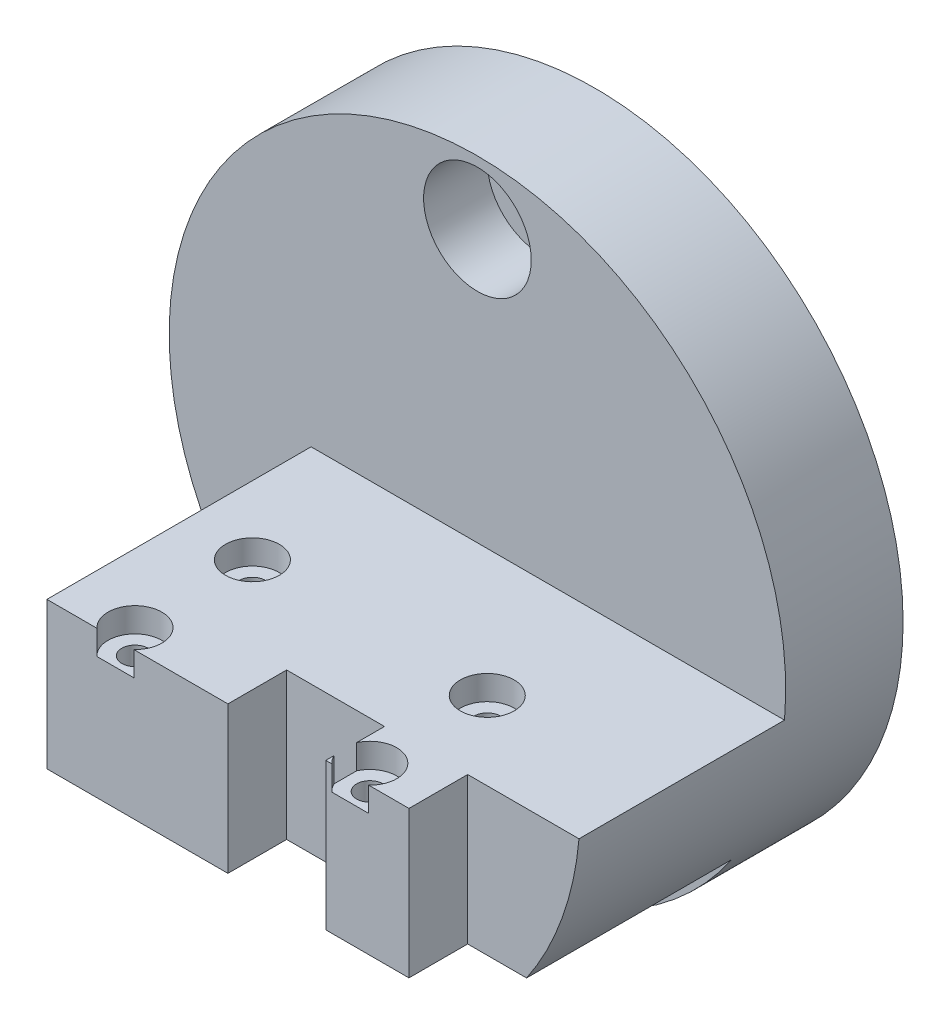
ISO-10303-21;
HEADER;
FILE_DESCRIPTION(('STEP AP214'),'2;1');
FILE_NAME('part.step','',(''),(''),'','','');
FILE_SCHEMA(('AUTOMOTIVE_DESIGN { 1 0 10303 214 1 1 1 1 }'));
ENDSEC;
DATA;
#1=APPLICATION_CONTEXT('core data for automotive mechanical design processes');
#2=APPLICATION_PROTOCOL_DEFINITION('international standard','automotive_design',2000,#1);
#3=PRODUCT_CONTEXT('',#1,'mechanical');
#4=PRODUCT('Part','Part','',(#3));
#5=PRODUCT_RELATED_PRODUCT_CATEGORY('part','',(#4));
#6=PRODUCT_DEFINITION_FORMATION('','',#4);
#7=PRODUCT_DEFINITION_CONTEXT('part definition',#1,'design');
#8=PRODUCT_DEFINITION('design','',#6,#7);
#9=PRODUCT_DEFINITION_SHAPE('','',#8);
#10=(LENGTH_UNIT() NAMED_UNIT(*) SI_UNIT(.MILLI.,.METRE.));
#11=(NAMED_UNIT(*) PLANE_ANGLE_UNIT() SI_UNIT($,.RADIAN.));
#12=(NAMED_UNIT(*) SI_UNIT($,.STERADIAN.) SOLID_ANGLE_UNIT());
#13=UNCERTAINTY_MEASURE_WITH_UNIT(LENGTH_MEASURE(1.E-05),#10,'distance_accuracy_value','');
#14=(GEOMETRIC_REPRESENTATION_CONTEXT(3) GLOBAL_UNCERTAINTY_ASSIGNED_CONTEXT((#13)) GLOBAL_UNIT_ASSIGNED_CONTEXT((#10,
#11,#12)) REPRESENTATION_CONTEXT('',''));
#15=CARTESIAN_POINT('',(0.,0.,0.));
#16=DIRECTION('',(0.,0.,1.));
#17=DIRECTION('',(1.,0.,0.));
#18=AXIS2_PLACEMENT_3D('',#15,#16,#17);
#19=CARTESIAN_POINT('',(31.3797307190486,-2.75,39.));
#20=DIRECTION('',(0.,1.,0.));
#21=DIRECTION('',(0.,0.,1.));
#22=AXIS2_PLACEMENT_3D('',#19,#20,#21);
#23=PLANE('',#22);
#24=DIRECTION('',(0.,0.,-1.));
#25=VECTOR('',#24,1.);
#26=CARTESIAN_POINT('',(11.5047931890486,-2.75,39.));
#27=LINE('',#26,#25);
#28=CARTESIAN_POINT('',(11.5047931890486,-2.75,39.));
#29=VERTEX_POINT('',#28);
#30=CARTESIAN_POINT('',(11.5047931890486,-2.75,38.145643923739));
#31=VERTEX_POINT('',#30);
#32=EDGE_CURVE('E259',#29,#31,#27,.T.);
#33=ORIENTED_EDGE('',*,*,#32,.F.);
#34=DIRECTION('',(1.,0.,0.));
#35=VECTOR('',#34,1.);
#36=CARTESIAN_POINT('',(31.3797307190486,-2.75,39.));
#37=LINE('',#36,#35);
#38=CARTESIAN_POINT('',(12.1173345802309,-2.75,39.));
#39=VERTEX_POINT('',#38);
#40=EDGE_CURVE('E261',#29,#39,#37,.T.);
#41=ORIENTED_EDGE('',*,*,#40,.T.);
#42=CARTESIAN_POINT('',(14.0047931890486,-2.75,37.));
#43=DIRECTION('',(0.,1.,0.));
#44=DIRECTION('',(0.,0.,1.));
#45=AXIS2_PLACEMENT_3D('',#42,#43,#44);
#46=CIRCLE('',#45,2.75);
#47=EDGE_CURVE('E245',#31,#39,#46,.T.);
#48=ORIENTED_EDGE('',*,*,#47,.F.);
#49=EDGE_LOOP('',(#33,#41,#48));
#50=FACE_BOUND('',#49,.T.);
#51=ADVANCED_FACE('F33',(#50),#23,.T.);
#52=CARTESIAN_POINT('',(0.,0.,39.));
#53=DIRECTION('',(0.,0.,1.));
#54=DIRECTION('',(1.,0.,0.));
#55=AXIS2_PLACEMENT_3D('',#52,#53,#54);
#56=PLANE('',#55);
#57=DIRECTION('',(0.,1.,0.));
#58=VECTOR('',#57,1.);
#59=CARTESIAN_POINT('',(-16.9952068109514,-17.75,39.));
#60=LINE('',#59,#58);
#61=CARTESIAN_POINT('',(-16.9952068109514,-17.75,39.));
#62=VERTEX_POINT('',#61);
#63=CARTESIAN_POINT('',(-16.9952068109514,-2.75,39.));
#64=VERTEX_POINT('',#63);
#65=EDGE_CURVE('E153',#62,#64,#60,.T.);
#66=ORIENTED_EDGE('',*,*,#65,.F.);
#67=DIRECTION('',(-1.,0.,0.));
#68=VECTOR('',#67,1.);
#69=CARTESIAN_POINT('',(26.0228265182705,-17.75,39.));
#70=LINE('',#69,#68);
#71=CARTESIAN_POINT('',(1.50479318904857,-17.75,39.));
#72=VERTEX_POINT('',#71);
#73=EDGE_CURVE('E165',#72,#62,#70,.T.);
#74=ORIENTED_EDGE('',*,*,#73,.F.);
#75=DIRECTION('',(0.,1.,0.));
#76=VECTOR('',#75,1.);
#77=CARTESIAN_POINT('',(1.50479318904857,-17.75,39.));
#78=LINE('',#77,#76);
#79=CARTESIAN_POINT('',(1.50479318904857,-2.75,39.));
#80=VERTEX_POINT('',#79);
#81=EDGE_CURVE('E663',#72,#80,#78,.T.);
#82=ORIENTED_EDGE('',*,*,#81,.T.);
#83=CARTESIAN_POINT('',(-8.10774820213375,-2.75,39.));
#84=VERTEX_POINT('',#83);
#85=EDGE_CURVE('E293',#84,#80,#37,.T.);
#86=ORIENTED_EDGE('',*,*,#85,.F.);
#87=DIRECTION('',(0.,1.,0.));
#88=VECTOR('',#87,1.);
#89=CARTESIAN_POINT('',(-8.10774820213375,-2.75,39.));
#90=LINE('',#89,#88);
#91=CARTESIAN_POINT('',(-8.10774820213375,-5.25,39.));
#92=VERTEX_POINT('',#91);
#93=EDGE_CURVE('E224',#92,#84,#90,.T.);
#94=ORIENTED_EDGE('',*,*,#93,.F.);
#95=DIRECTION('',(1.,0.,0.));
#96=VECTOR('',#95,1.);
#97=CARTESIAN_POINT('',(0.,-5.25,39.));
#98=LINE('',#97,#96);
#99=CARTESIAN_POINT('',(-11.8826654197691,-5.25,39.));
#100=VERTEX_POINT('',#99);
#101=EDGE_CURVE('E222',#100,#92,#98,.T.);
#102=ORIENTED_EDGE('',*,*,#101,.F.);
#103=DIRECTION('',(0.,1.,0.));
#104=VECTOR('',#103,1.);
#105=CARTESIAN_POINT('',(-11.8826654197691,-2.75,39.));
#106=LINE('',#105,#104);
#107=CARTESIAN_POINT('',(-11.8826654197691,-2.75,39.));
#108=VERTEX_POINT('',#107);
#109=EDGE_CURVE('E218',#108,#100,#106,.F.);
#110=ORIENTED_EDGE('',*,*,#109,.F.);
#111=EDGE_CURVE('E178',#64,#108,#37,.T.);
#112=ORIENTED_EDGE('',*,*,#111,.F.);
#113=EDGE_LOOP('',(#66,#74,#82,#86,#94,#102,#110,#112));
#114=FACE_BOUND('',#113,.T.);
#115=ADVANCED_FACE('F311',(#114),#56,.T.);
#116=CARTESIAN_POINT('',(14.0047931890486,-2.75,37.));
#117=DIRECTION('',(0.,1.,0.));
#118=DIRECTION('',(0.,0.,1.));
#119=AXIS2_PLACEMENT_3D('',#116,#117,#118);
#120=CYLINDRICAL_SURFACE('',#119,2.75);
#121=CARTESIAN_POINT('',(15.8922517978663,-2.75,39.));
#122=VERTEX_POINT('',#121);
#123=CARTESIAN_POINT('',(11.5047931890486,-2.75,35.854356076261));
#124=VERTEX_POINT('',#123);
#125=EDGE_CURVE('E262',#122,#124,#46,.T.);
#126=ORIENTED_EDGE('',*,*,#125,.T.);
#127=DIRECTION('',(0.,1.,0.));
#128=VECTOR('',#127,1.);
#129=CARTESIAN_POINT('',(11.5047931890486,-2.75,35.854356076261));
#130=LINE('',#129,#128);
#131=CARTESIAN_POINT('',(11.5047931890486,-5.25,35.854356076261));
#132=VERTEX_POINT('',#131);
#133=EDGE_CURVE('E11',#124,#132,#130,.F.);
#134=ORIENTED_EDGE('',*,*,#133,.T.);
#135=CARTESIAN_POINT('',(14.0047931890486,-5.25,37.));
#136=DIRECTION('',(0.,1.,0.));
#137=DIRECTION('',(0.,0.,1.));
#138=AXIS2_PLACEMENT_3D('',#135,#136,#137);
#139=CIRCLE('',#138,2.75);
#140=CARTESIAN_POINT('',(15.8922517978663,-5.25,39.));
#141=VERTEX_POINT('',#140);
#142=EDGE_CURVE('E268',#141,#132,#139,.T.);
#143=ORIENTED_EDGE('',*,*,#142,.F.);
#144=DIRECTION('',(0.,1.,0.));
#145=VECTOR('',#144,1.);
#146=CARTESIAN_POINT('',(15.8922517978663,-2.75,39.));
#147=LINE('',#146,#145);
#148=EDGE_CURVE('E236',#141,#122,#147,.T.);
#149=ORIENTED_EDGE('',*,*,#148,.T.);
#150=EDGE_LOOP('',(#126,#134,#143,#149));
#151=FACE_BOUND('',#150,.T.);
#152=ADVANCED_FACE('F335',(#151),#120,.F.);
#153=CARTESIAN_POINT('',(0.,0.,12.));
#154=DIRECTION('',(0.,0.,1.));
#155=DIRECTION('',(1.,0.,0.));
#156=AXIS2_PLACEMENT_3D('',#153,#154,#155);
#157=PLANE('',#156);
#158=CARTESIAN_POINT('',(0.,25.,12.));
#159=DIRECTION('',(0.,0.,1.));
#160=DIRECTION('',(1.,0.,0.));
#161=AXIS2_PLACEMENT_3D('',#158,#159,#160);
#162=CIRCLE('',#161,5.5);
#163=CARTESIAN_POINT('',(5.5,25.,12.));
#164=VERTEX_POINT('',#163);
#165=EDGE_CURVE('E190',#164,#164,#162,.T.);
#166=ORIENTED_EDGE('',*,*,#165,.F.);
#167=EDGE_LOOP('',(#166));
#168=FACE_BOUND('',#167,.T.);
#169=DIRECTION('',(1.,0.,0.));
#170=VECTOR('',#169,1.);
#171=CARTESIAN_POINT('',(31.3797307190486,-2.75,12.));
#172=LINE('',#171,#170);
#173=CARTESIAN_POINT('',(-16.9952068109514,-2.75,12.));
#174=VERTEX_POINT('',#173);
#175=CARTESIAN_POINT('',(31.3797307190486,-2.75,12.));
#176=VERTEX_POINT('',#175);
#177=EDGE_CURVE('E170',#174,#176,#172,.T.);
#178=ORIENTED_EDGE('',*,*,#177,.T.);
#179=CARTESIAN_POINT('',(0.,0.,12.));
#180=DIRECTION('',(0.,0.,1.));
#181=DIRECTION('',(1.,0.,0.));
#182=AXIS2_PLACEMENT_3D('',#179,#180,#181);
#183=CIRCLE('',#182,31.5);
#184=CARTESIAN_POINT('',(26.0228265182705,-17.75,12.));
#185=VERTEX_POINT('',#184);
#186=EDGE_CURVE('E169',#176,#185,#183,.T.);
#187=ORIENTED_EDGE('',*,*,#186,.T.);
#188=DIRECTION('',(-1.,0.,0.));
#189=VECTOR('',#188,1.);
#190=CARTESIAN_POINT('',(26.0228265182705,-17.75,12.));
#191=LINE('',#190,#189);
#192=CARTESIAN_POINT('',(-16.9952068109514,-17.75,12.));
#193=VERTEX_POINT('',#192);
#194=EDGE_CURVE('E161',#185,#193,#191,.T.);
#195=ORIENTED_EDGE('',*,*,#194,.T.);
#196=DIRECTION('',(0.,1.,0.));
#197=VECTOR('',#196,1.);
#198=CARTESIAN_POINT('',(-16.9952068109514,-17.75,12.));
#199=LINE('',#198,#197);
#200=EDGE_CURVE('E144',#193,#174,#199,.T.);
#201=ORIENTED_EDGE('',*,*,#200,.T.);
#202=EDGE_LOOP('',(#178,#187,#195,#201));
#203=FACE_BOUND('',#202,.T.);
#204=CARTESIAN_POINT('',(0.,-25.,12.));
#205=DIRECTION('',(0.,0.,1.));
#206=DIRECTION('',(1.,0.,0.));
#207=AXIS2_PLACEMENT_3D('',#204,#205,#206);
#208=CIRCLE('',#207,5.5);
#209=CARTESIAN_POINT('',(5.5,-25.,12.));
#210=VERTEX_POINT('',#209);
#211=EDGE_CURVE('E204',#210,#210,#208,.T.);
#212=ORIENTED_EDGE('',*,*,#211,.F.);
#213=EDGE_LOOP('',(#212));
#214=FACE_BOUND('',#213,.T.);
#215=ADVANCED_FACE('F167',(#168,#203,#214),#157,.T.);
#216=CARTESIAN_POINT('',(0.,0.,12.));
#217=DIRECTION('',(0.,0.,-1.));
#218=DIRECTION('',(-1.,0.,0.));
#219=AXIS2_PLACEMENT_3D('',#216,#217,#218);
#220=CYLINDRICAL_SURFACE('',#219,31.5);
#221=ORIENTED_EDGE('',*,*,#186,.F.);
#222=DIRECTION('',(0.,0.,-1.));
#223=VECTOR('',#222,1.);
#224=CARTESIAN_POINT('',(31.3797307190486,-2.75,39.));
#225=LINE('',#224,#223);
#226=CARTESIAN_POINT('',(31.3797307190486,-2.75,33.));
#227=VERTEX_POINT('',#226);
#228=EDGE_CURVE('E181',#227,#176,#225,.T.);
#229=ORIENTED_EDGE('',*,*,#228,.F.);
#230=CARTESIAN_POINT('',(0.,0.,33.));
#231=DIRECTION('',(0.,0.,-1.));
#232=DIRECTION('',(-1.,0.,0.));
#233=AXIS2_PLACEMENT_3D('',#230,#231,#232);
#234=CIRCLE('',#233,31.5);
#235=CARTESIAN_POINT('',(26.0228265182705,-17.75,33.));
#236=VERTEX_POINT('',#235);
#237=EDGE_CURVE('E429',#227,#236,#234,.T.);
#238=ORIENTED_EDGE('',*,*,#237,.T.);
#239=DIRECTION('',(0.,0.,-1.));
#240=VECTOR('',#239,1.);
#241=CARTESIAN_POINT('',(26.0228265182705,-17.75,39.));
#242=LINE('',#241,#240);
#243=EDGE_CURVE('E185',#236,#185,#242,.T.);
#244=ORIENTED_EDGE('',*,*,#243,.T.);
#245=EDGE_LOOP('',(#221,#229,#238,#244));
#246=FACE_BOUND('',#245,.T.);
#247=CARTESIAN_POINT('',(0.,0.,0.));
#248=DIRECTION('',(0.,0.,1.));
#249=DIRECTION('',(1.,0.,0.));
#250=AXIS2_PLACEMENT_3D('',#247,#248,#249);
#251=CIRCLE('',#250,31.5);
#252=CARTESIAN_POINT('',(31.5,0.,0.));
#253=VERTEX_POINT('',#252);
#254=EDGE_CURVE('E216',#253,#253,#251,.T.);
#255=ORIENTED_EDGE('',*,*,#254,.T.);
#256=EDGE_LOOP('',(#255));
#257=FACE_BOUND('',#256,.T.);
#258=ADVANCED_FACE('F35',(#246,#257),#220,.T.);
#259=CARTESIAN_POINT('',(0.,0.,0.));
#260=DIRECTION('',(0.,0.,1.));
#261=DIRECTION('',(1.,0.,0.));
#262=AXIS2_PLACEMENT_3D('',#259,#260,#261);
#263=PLANE('',#262);
#264=CARTESIAN_POINT('',(-17.6776695296637,17.6776695296637,0.));
#265=DIRECTION('',(0.,0.,-1.));
#266=DIRECTION('',(-1.,0.,0.));
#267=AXIS2_PLACEMENT_3D('',#264,#265,#266);
#268=CIRCLE('',#267,3.15);
#269=CARTESIAN_POINT('',(-20.8276695296637,17.6776695296637,0.));
#270=VERTEX_POINT('',#269);
#271=EDGE_CURVE('E184',#270,#270,#268,.T.);
#272=ORIENTED_EDGE('',*,*,#271,.F.);
#273=EDGE_LOOP('',(#272));
#274=FACE_BOUND('',#273,.T.);
#275=CARTESIAN_POINT('',(0.,25.,0.));
#276=DIRECTION('',(0.,0.,1.));
#277=DIRECTION('',(1.,0.,0.));
#278=AXIS2_PLACEMENT_3D('',#275,#276,#277);
#279=CIRCLE('',#278,3.3);
#280=CARTESIAN_POINT('',(3.3,25.,0.));
#281=VERTEX_POINT('',#280);
#282=EDGE_CURVE('E201',#281,#281,#279,.T.);
#283=ORIENTED_EDGE('',*,*,#282,.T.);
#284=EDGE_LOOP('',(#283));
#285=FACE_BOUND('',#284,.T.);
#286=CARTESIAN_POINT('',(0.,-25.,0.));
#287=DIRECTION('',(0.,0.,1.));
#288=DIRECTION('',(1.,0.,0.));
#289=AXIS2_PLACEMENT_3D('',#286,#287,#288);
#290=CIRCLE('',#289,3.3);
#291=CARTESIAN_POINT('',(3.3,-25.,0.));
#292=VERTEX_POINT('',#291);
#293=EDGE_CURVE('E213',#292,#292,#290,.T.);
#294=ORIENTED_EDGE('',*,*,#293,.T.);
#295=EDGE_LOOP('',(#294));
#296=FACE_BOUND('',#295,.T.);
#297=ORIENTED_EDGE('',*,*,#254,.F.);
#298=EDGE_LOOP('',(#297));
#299=FACE_BOUND('',#298,.T.);
#300=ADVANCED_FACE('F377',(#274,#285,#296,#299),#263,.F.);
#301=CARTESIAN_POINT('',(0.,-25.,12.));
#302=DIRECTION('',(0.,0.,1.));
#303=DIRECTION('',(1.,0.,0.));
#304=AXIS2_PLACEMENT_3D('',#301,#302,#303);
#305=CYLINDRICAL_SURFACE('',#304,3.3);
#306=ORIENTED_EDGE('',*,*,#293,.F.);
#307=EDGE_LOOP('',(#306));
#308=FACE_BOUND('',#307,.T.);
#309=CARTESIAN_POINT('',(0.,-25.,5.5));
#310=DIRECTION('',(0.,0.,1.));
#311=DIRECTION('',(1.,0.,0.));
#312=AXIS2_PLACEMENT_3D('',#309,#310,#311);
#313=CIRCLE('',#312,3.3);
#314=CARTESIAN_POINT('',(3.3,-25.,5.5));
#315=VERTEX_POINT('',#314);
#316=EDGE_CURVE('E210',#315,#315,#313,.T.);
#317=ORIENTED_EDGE('',*,*,#316,.T.);
#318=EDGE_LOOP('',(#317));
#319=FACE_BOUND('',#318,.T.);
#320=ADVANCED_FACE('F373',(#308,#319),#305,.F.);
#321=CARTESIAN_POINT('',(3.3,-25.,5.5));
#322=DIRECTION('',(0.,0.,-1.));
#323=DIRECTION('',(-1.,0.,0.));
#324=AXIS2_PLACEMENT_3D('',#321,#322,#323);
#325=PLANE('',#324);
#326=ORIENTED_EDGE('',*,*,#316,.F.);
#327=EDGE_LOOP('',(#326));
#328=FACE_BOUND('',#327,.T.);
#329=CARTESIAN_POINT('',(0.,-25.,5.5));
#330=DIRECTION('',(0.,0.,1.));
#331=DIRECTION('',(1.,0.,0.));
#332=AXIS2_PLACEMENT_3D('',#329,#330,#331);
#333=CIRCLE('',#332,5.5);
#334=CARTESIAN_POINT('',(5.5,-25.,5.5));
#335=VERTEX_POINT('',#334);
#336=EDGE_CURVE('E207',#335,#335,#333,.T.);
#337=ORIENTED_EDGE('',*,*,#336,.T.);
#338=EDGE_LOOP('',(#337));
#339=FACE_BOUND('',#338,.T.);
#340=ADVANCED_FACE('F369',(#328,#339),#325,.F.);
#341=CARTESIAN_POINT('',(0.,-25.,12.));
#342=DIRECTION('',(0.,0.,1.));
#343=DIRECTION('',(1.,0.,0.));
#344=AXIS2_PLACEMENT_3D('',#341,#342,#343);
#345=CYLINDRICAL_SURFACE('',#344,5.5);
#346=ORIENTED_EDGE('',*,*,#336,.F.);
#347=EDGE_LOOP('',(#346));
#348=FACE_BOUND('',#347,.T.);
#349=ORIENTED_EDGE('',*,*,#211,.T.);
#350=EDGE_LOOP('',(#349));
#351=FACE_BOUND('',#350,.T.);
#352=ADVANCED_FACE('F365',(#348,#351),#345,.F.);
#353=CARTESIAN_POINT('',(0.,25.,12.));
#354=DIRECTION('',(0.,0.,1.));
#355=DIRECTION('',(1.,0.,0.));
#356=AXIS2_PLACEMENT_3D('',#353,#354,#355);
#357=CYLINDRICAL_SURFACE('',#356,3.3);
#358=ORIENTED_EDGE('',*,*,#282,.F.);
#359=EDGE_LOOP('',(#358));
#360=FACE_BOUND('',#359,.T.);
#361=CARTESIAN_POINT('',(0.,25.,5.5));
#362=DIRECTION('',(0.,0.,1.));
#363=DIRECTION('',(1.,0.,0.));
#364=AXIS2_PLACEMENT_3D('',#361,#362,#363);
#365=CIRCLE('',#364,3.3);
#366=CARTESIAN_POINT('',(3.3,25.,5.5));
#367=VERTEX_POINT('',#366);
#368=EDGE_CURVE('E198',#367,#367,#365,.T.);
#369=ORIENTED_EDGE('',*,*,#368,.T.);
#370=EDGE_LOOP('',(#369));
#371=FACE_BOUND('',#370,.T.);
#372=ADVANCED_FACE('F361',(#360,#371),#357,.F.);
#373=CARTESIAN_POINT('',(3.3,25.,5.5));
#374=DIRECTION('',(0.,0.,-1.));
#375=DIRECTION('',(-1.,0.,0.));
#376=AXIS2_PLACEMENT_3D('',#373,#374,#375);
#377=PLANE('',#376);
#378=ORIENTED_EDGE('',*,*,#368,.F.);
#379=EDGE_LOOP('',(#378));
#380=FACE_BOUND('',#379,.T.);
#381=CARTESIAN_POINT('',(0.,25.,5.5));
#382=DIRECTION('',(0.,0.,1.));
#383=DIRECTION('',(1.,0.,0.));
#384=AXIS2_PLACEMENT_3D('',#381,#382,#383);
#385=CIRCLE('',#384,5.5);
#386=CARTESIAN_POINT('',(5.5,25.,5.5));
#387=VERTEX_POINT('',#386);
#388=EDGE_CURVE('E195',#387,#387,#385,.T.);
#389=ORIENTED_EDGE('',*,*,#388,.T.);
#390=EDGE_LOOP('',(#389));
#391=FACE_BOUND('',#390,.T.);
#392=ADVANCED_FACE('F357',(#380,#391),#377,.F.);
#393=CARTESIAN_POINT('',(0.,25.,12.));
#394=DIRECTION('',(0.,0.,1.));
#395=DIRECTION('',(1.,0.,0.));
#396=AXIS2_PLACEMENT_3D('',#393,#394,#395);
#397=CYLINDRICAL_SURFACE('',#396,5.5);
#398=ORIENTED_EDGE('',*,*,#388,.F.);
#399=EDGE_LOOP('',(#398));
#400=FACE_BOUND('',#399,.T.);
#401=ORIENTED_EDGE('',*,*,#165,.T.);
#402=EDGE_LOOP('',(#401));
#403=FACE_BOUND('',#402,.T.);
#404=ADVANCED_FACE('F351',(#400,#403),#397,.F.);
#405=CARTESIAN_POINT('',(-17.6776695296637,17.6776695296637,6.5));
#406=DIRECTION('',(0.,0.,-1.));
#407=DIRECTION('',(-1.,0.,0.));
#408=AXIS2_PLACEMENT_3D('',#405,#406,#407);
#409=CYLINDRICAL_SURFACE('',#408,3.15);
#410=CARTESIAN_POINT('',(-17.6776695296637,17.6776695296637,6.5));
#411=DIRECTION('',(0.,0.,-1.));
#412=DIRECTION('',(-1.,0.,0.));
#413=AXIS2_PLACEMENT_3D('',#410,#411,#412);
#414=CIRCLE('',#413,3.15);
#415=CARTESIAN_POINT('',(-20.8276695296637,17.6776695296637,6.5));
#416=VERTEX_POINT('',#415);
#417=EDGE_CURVE('E187',#416,#416,#414,.T.);
#418=CARTESIAN_POINT('',(-20.8276695296637,17.6776695296637,6.5));
#419=CARTESIAN_POINT('',(-20.8276695296637,17.6776695296637,6.43229166666667));
#420=CARTESIAN_POINT('',(-20.8276695296637,17.6776695296637,6.36458333333333));
#421=CARTESIAN_POINT('',(-20.8276695296637,17.6776695296637,6.22916666666667));
#422=CARTESIAN_POINT('',(-20.8276695296637,17.6776695296637,6.16145833333333));
#423=CARTESIAN_POINT('',(-20.8276695296637,17.6776695296637,6.02604166666667));
#424=CARTESIAN_POINT('',(-20.8276695296637,17.6776695296637,5.95833333333333));
#425=CARTESIAN_POINT('',(-20.8276695296637,17.6776695296637,5.82291666666667));
#426=CARTESIAN_POINT('',(-20.8276695296637,17.6776695296637,5.75520833333333));
#427=CARTESIAN_POINT('',(-20.8276695296637,17.6776695296637,5.61979166666667));
#428=CARTESIAN_POINT('',(-20.8276695296637,17.6776695296637,5.55208333333333));
#429=CARTESIAN_POINT('',(-20.8276695296637,17.6776695296637,5.41666666666667));
#430=CARTESIAN_POINT('',(-20.8276695296637,17.6776695296637,5.34895833333333));
#431=CARTESIAN_POINT('',(-20.8276695296637,17.6776695296637,5.21354166666667));
#432=CARTESIAN_POINT('',(-20.8276695296637,17.6776695296637,5.14583333333333));
#433=CARTESIAN_POINT('',(-20.8276695296637,17.6776695296637,5.01041666666667));
#434=CARTESIAN_POINT('',(-20.8276695296637,17.6776695296637,4.94270833333333));
#435=CARTESIAN_POINT('',(-20.8276695296637,17.6776695296637,4.80729166666667));
#436=CARTESIAN_POINT('',(-20.8276695296637,17.6776695296637,4.73958333333333));
#437=CARTESIAN_POINT('',(-20.8276695296637,17.6776695296637,4.60416666666667));
#438=CARTESIAN_POINT('',(-20.8276695296637,17.6776695296637,4.53645833333333));
#439=CARTESIAN_POINT('',(-20.8276695296637,17.6776695296637,4.40104166666667));
#440=CARTESIAN_POINT('',(-20.8276695296637,17.6776695296637,4.33333333333333));
#441=CARTESIAN_POINT('',(-20.8276695296637,17.6776695296637,4.19791666666667));
#442=CARTESIAN_POINT('',(-20.8276695296637,17.6776695296637,4.13020833333333));
#443=CARTESIAN_POINT('',(-20.8276695296637,17.6776695296637,3.99479166666667));
#444=CARTESIAN_POINT('',(-20.8276695296637,17.6776695296637,3.92708333333333));
#445=CARTESIAN_POINT('',(-20.8276695296637,17.6776695296637,3.79166666666667));
#446=CARTESIAN_POINT('',(-20.8276695296637,17.6776695296637,3.72395833333333));
#447=CARTESIAN_POINT('',(-20.8276695296637,17.6776695296637,3.58854166666667));
#448=CARTESIAN_POINT('',(-20.8276695296637,17.6776695296637,3.52083333333333));
#449=CARTESIAN_POINT('',(-20.8276695296637,17.6776695296637,3.38541666666667));
#450=CARTESIAN_POINT('',(-20.8276695296637,17.6776695296637,3.31770833333333));
#451=CARTESIAN_POINT('',(-20.8276695296637,17.6776695296637,3.18229166666667));
#452=CARTESIAN_POINT('',(-20.8276695296637,17.6776695296637,3.11458333333333));
#453=CARTESIAN_POINT('',(-20.8276695296637,17.6776695296637,2.97916666666667));
#454=CARTESIAN_POINT('',(-20.8276695296637,17.6776695296637,2.91145833333333));
#455=CARTESIAN_POINT('',(-20.8276695296637,17.6776695296637,2.77604166666667));
#456=CARTESIAN_POINT('',(-20.8276695296637,17.6776695296637,2.70833333333333));
#457=CARTESIAN_POINT('',(-20.8276695296637,17.6776695296637,2.57291666666667));
#458=CARTESIAN_POINT('',(-20.8276695296637,17.6776695296637,2.50520833333333));
#459=CARTESIAN_POINT('',(-20.8276695296637,17.6776695296637,2.36979166666667));
#460=CARTESIAN_POINT('',(-20.8276695296637,17.6776695296637,2.30208333333333));
#461=CARTESIAN_POINT('',(-20.8276695296637,17.6776695296637,2.16666666666667));
#462=CARTESIAN_POINT('',(-20.8276695296637,17.6776695296637,2.09895833333333));
#463=CARTESIAN_POINT('',(-20.8276695296637,17.6776695296637,1.96354166666667));
#464=CARTESIAN_POINT('',(-20.8276695296637,17.6776695296637,1.89583333333333));
#465=CARTESIAN_POINT('',(-20.8276695296637,17.6776695296637,1.76041666666667));
#466=CARTESIAN_POINT('',(-20.8276695296637,17.6776695296637,1.69270833333333));
#467=CARTESIAN_POINT('',(-20.8276695296637,17.6776695296637,1.55729166666667));
#468=CARTESIAN_POINT('',(-20.8276695296637,17.6776695296637,1.48958333333333));
#469=CARTESIAN_POINT('',(-20.8276695296637,17.6776695296637,1.35416666666667));
#470=CARTESIAN_POINT('',(-20.8276695296637,17.6776695296637,1.28645833333333));
#471=CARTESIAN_POINT('',(-20.8276695296637,17.6776695296637,1.15104166666667));
#472=CARTESIAN_POINT('',(-20.8276695296637,17.6776695296637,1.08333333333333));
#473=CARTESIAN_POINT('',(-20.8276695296637,17.6776695296637,0.947916666666667));
#474=CARTESIAN_POINT('',(-20.8276695296637,17.6776695296637,0.880208333333333));
#475=CARTESIAN_POINT('',(-20.8276695296637,17.6776695296637,0.744791666666667));
#476=CARTESIAN_POINT('',(-20.8276695296637,17.6776695296637,0.677083333333333));
#477=CARTESIAN_POINT('',(-20.8276695296637,17.6776695296637,0.541666666666667));
#478=CARTESIAN_POINT('',(-20.8276695296637,17.6776695296637,0.473958333333333));
#479=CARTESIAN_POINT('',(-20.8276695296637,17.6776695296637,0.338541666666667));
#480=CARTESIAN_POINT('',(-20.8276695296637,17.6776695296637,0.270833333333334));
#481=CARTESIAN_POINT('',(-20.8276695296637,17.6776695296637,0.135416666666667));
#482=CARTESIAN_POINT('',(-20.8276695296637,17.6776695296637,0.0677083333333334));
#483=CARTESIAN_POINT('',(-20.8276695296637,17.6776695296637,0.));
#484=B_SPLINE_CURVE_WITH_KNOTS('',3,(#418,#419,#420,#421,#422,#423,#424,#425,#426,#427,#428,
#429,#430,#431,#432,#433,#434,#435,#436,#437,#438,#439,#440,#441,#442,#443,#444,#445,#446,#447,
#448,#449,#450,#451,#452,#453,#454,#455,#456,#457,#458,#459,#460,#461,#462,#463,#464,#465,#466,
#467,#468,#469,#470,#471,#472,#473,#474,#475,#476,#477,#478,#479,#480,#481,#482,#483),
.UNSPECIFIED.,.F.,.F.,(4,2,2,2,2,2,2,2,2,2,2,2,2,2,2,2,2,2,2,2,2,2,2,2,2,2,2,2,2,2,2,2,4),(0.,
0.203124999999999,0.40625,0.609375,0.8125,1.015625,1.21875,1.421875,1.625,1.828125,2.03125,
2.234375,2.4375,2.640625,2.84375,3.046875,3.25,3.453125,3.65625,3.859375,4.0625,4.265625,
4.46875,4.671875,4.875,5.078125,5.28125,5.484375,5.6875,5.890625,6.09375,6.296875,6.5),.UNSPECIFIED.);
#485=EDGE_CURVE('BSEAM345',#416,#270,#484,.T.);
#486=ORIENTED_EDGE('',*,*,#417,.F.);
#487=ORIENTED_EDGE('',*,*,#271,.T.);
#488=ORIENTED_EDGE('',*,*,#485,.T.);
#489=ORIENTED_EDGE('',*,*,#485,.F.);
#490=EDGE_LOOP('',(#486,#488,#487,#489));
#491=FACE_BOUND('',#490,.T.);
#492=ADVANCED_FACE('F345',(#491),#409,.F.);
#493=CARTESIAN_POINT('',(-17.6776695296637,17.6776695296637,6.5));
#494=DIRECTION('',(0.,0.,-1.));
#495=DIRECTION('',(-1.,0.,0.));
#496=AXIS2_PLACEMENT_3D('',#493,#494,#495);
#497=PLANE('',#496);
#498=ORIENTED_EDGE('',*,*,#417,.T.);
#499=EDGE_LOOP('',(#498));
#500=FACE_BOUND('',#499,.T.);
#501=ADVANCED_FACE('F340',(#500),#497,.T.);
#502=DIRECTION('',(0.,0.,-1.));
#503=VECTOR('',#502,1.);
#504=CARTESIAN_POINT('',(-16.9952068109514,-2.75,12.));
#505=LINE('',#504,#503);
#506=EDGE_CURVE('E147',#64,#174,#505,.T.);
#507=ORIENTED_EDGE('',*,*,#506,.F.);
#508=ORIENTED_EDGE('',*,*,#111,.T.);
#509=CARTESIAN_POINT('',(-9.99520681095144,-2.75,37.));
#510=DIRECTION('',(0.,1.,0.));
#511=DIRECTION('',(0.,0.,1.));
#512=AXIS2_PLACEMENT_3D('',#509,#510,#511);
#513=CIRCLE('',#512,2.75);
#514=EDGE_CURVE('E241',#84,#108,#513,.T.);
#515=ORIENTED_EDGE('',*,*,#514,.F.);
#516=ORIENTED_EDGE('',*,*,#85,.T.);
#517=DIRECTION('',(0.,0.,1.));
#518=VECTOR('',#517,1.);
#519=CARTESIAN_POINT('',(1.50479318904857,-2.75,39.));
#520=LINE('',#519,#518);
#521=CARTESIAN_POINT('',(1.50479318904857,-2.75,33.));
#522=VERTEX_POINT('',#521);
#523=EDGE_CURVE('E425',#522,#80,#520,.T.);
#524=ORIENTED_EDGE('',*,*,#523,.F.);
#525=DIRECTION('',(-1.,0.,0.));
#526=VECTOR('',#525,1.);
#527=CARTESIAN_POINT('',(1.50479318904857,-2.75,33.));
#528=LINE('',#527,#526);
#529=CARTESIAN_POINT('',(11.5047931890486,-2.75,33.));
#530=VERTEX_POINT('',#529);
#531=EDGE_CURVE('E683',#530,#522,#528,.T.);
#532=ORIENTED_EDGE('',*,*,#531,.F.);
#533=EDGE_CURVE('E681',#124,#530,#27,.T.);
#534=ORIENTED_EDGE('',*,*,#533,.F.);
#535=ORIENTED_EDGE('',*,*,#125,.F.);
#536=CARTESIAN_POINT('',(20.0047931890486,-2.75,39.));
#537=VERTEX_POINT('',#536);
#538=EDGE_CURVE('E288',#122,#537,#37,.T.);
#539=ORIENTED_EDGE('',*,*,#538,.T.);
#540=DIRECTION('',(0.,0.,1.));
#541=VECTOR('',#540,1.);
#542=CARTESIAN_POINT('',(20.0047931890486,-2.75,39.));
#543=LINE('',#542,#541);
#544=CARTESIAN_POINT('',(20.0047931890486,-2.75,33.));
#545=VERTEX_POINT('',#544);
#546=EDGE_CURVE('E48',#545,#537,#543,.T.);
#547=ORIENTED_EDGE('',*,*,#546,.F.);
#548=DIRECTION('',(-1.,0.,0.));
#549=VECTOR('',#548,1.);
#550=CARTESIAN_POINT('',(20.0047931890486,-2.75,33.));
#551=LINE('',#550,#549);
#552=EDGE_CURVE('E414',#227,#545,#551,.T.);
#553=ORIENTED_EDGE('',*,*,#552,.F.);
#554=ORIENTED_EDGE('',*,*,#228,.T.);
#555=ORIENTED_EDGE('',*,*,#177,.F.);
#556=EDGE_LOOP('',(#507,#508,#515,#516,#524,#532,#534,#535,#539,#547,#553,#554,#555));
#557=FACE_BOUND('',#556,.T.);
#558=CARTESIAN_POINT('',(-9.99520681095144,-2.75,25.));
#559=DIRECTION('',(0.,1.,0.));
#560=DIRECTION('',(0.,0.,1.));
#561=AXIS2_PLACEMENT_3D('',#558,#559,#560);
#562=CIRCLE('',#561,2.75);
#563=CARTESIAN_POINT('',(-9.99520681095144,-2.75,27.75));
#564=VERTEX_POINT('',#563);
#565=EDGE_CURVE('E431',#564,#564,#562,.T.);
#566=ORIENTED_EDGE('',*,*,#565,.F.);
#567=EDGE_LOOP('',(#566));
#568=FACE_BOUND('',#567,.T.);
#569=CARTESIAN_POINT('',(14.0047931890486,-2.75,25.));
#570=DIRECTION('',(0.,1.,0.));
#571=DIRECTION('',(0.,0.,1.));
#572=AXIS2_PLACEMENT_3D('',#569,#570,#571);
#573=CIRCLE('',#572,2.75);
#574=CARTESIAN_POINT('',(14.0047931890486,-2.75,27.75));
#575=VERTEX_POINT('',#574);
#576=EDGE_CURVE('E230',#575,#575,#573,.T.);
#577=ORIENTED_EDGE('',*,*,#576,.F.);
#578=EDGE_LOOP('',(#577));
#579=FACE_BOUND('',#578,.T.);
#580=ADVANCED_FACE('F302',(#557,#568,#579),#23,.T.);
#581=CARTESIAN_POINT('',(26.0228265182705,-17.75,39.));
#582=DIRECTION('',(0.,-1.,0.));
#583=DIRECTION('',(0.,0.,-1.));
#584=AXIS2_PLACEMENT_3D('',#581,#582,#583);
#585=PLANE('',#584);
#586=DIRECTION('',(0.,0.,-1.));
#587=VECTOR('',#586,1.);
#588=CARTESIAN_POINT('',(-16.9952068109514,-17.75,12.));
#589=LINE('',#588,#587);
#590=EDGE_CURVE('E56',#62,#193,#589,.T.);
#591=ORIENTED_EDGE('',*,*,#590,.T.);
#592=ORIENTED_EDGE('',*,*,#194,.F.);
#593=ORIENTED_EDGE('',*,*,#243,.F.);
#594=DIRECTION('',(-1.,0.,0.));
#595=VECTOR('',#594,1.);
#596=CARTESIAN_POINT('',(20.0047931890486,-17.75,33.));
#597=LINE('',#596,#595);
#598=CARTESIAN_POINT('',(20.0047931890486,-17.75,33.));
#599=VERTEX_POINT('',#598);
#600=EDGE_CURVE('E418',#236,#599,#597,.T.);
#601=ORIENTED_EDGE('',*,*,#600,.T.);
#602=DIRECTION('',(0.,0.,1.));
#603=VECTOR('',#602,1.);
#604=CARTESIAN_POINT('',(20.0047931890486,-17.75,39.));
#605=LINE('',#604,#603);
#606=CARTESIAN_POINT('',(20.0047931890486,-17.75,39.));
#607=VERTEX_POINT('',#606);
#608=EDGE_CURVE('E416',#599,#607,#605,.T.);
#609=ORIENTED_EDGE('',*,*,#608,.T.);
#610=CARTESIAN_POINT('',(11.5047931890486,-17.75,39.));
#611=VERTEX_POINT('',#610);
#612=EDGE_CURVE('E286',#607,#611,#70,.T.);
#613=ORIENTED_EDGE('',*,*,#612,.T.);
#614=DIRECTION('',(0.,0.,-1.));
#615=VECTOR('',#614,1.);
#616=CARTESIAN_POINT('',(11.5047931890486,-17.75,39.));
#617=LINE('',#616,#615);
#618=CARTESIAN_POINT('',(11.5047931890486,-17.75,33.));
#619=VERTEX_POINT('',#618);
#620=EDGE_CURVE('E695',#611,#619,#617,.T.);
#621=ORIENTED_EDGE('',*,*,#620,.T.);
#622=DIRECTION('',(-1.,0.,0.));
#623=VECTOR('',#622,1.);
#624=CARTESIAN_POINT('',(1.50479318904857,-17.75,33.));
#625=LINE('',#624,#623);
#626=CARTESIAN_POINT('',(1.50479318904857,-17.75,33.));
#627=VERTEX_POINT('',#626);
#628=EDGE_CURVE('E669',#619,#627,#625,.T.);
#629=ORIENTED_EDGE('',*,*,#628,.T.);
#630=DIRECTION('',(0.,0.,1.));
#631=VECTOR('',#630,1.);
#632=CARTESIAN_POINT('',(1.50479318904857,-17.75,39.));
#633=LINE('',#632,#631);
#634=EDGE_CURVE('E688',#627,#72,#633,.T.);
#635=ORIENTED_EDGE('',*,*,#634,.T.);
#636=ORIENTED_EDGE('',*,*,#73,.T.);
#637=EDGE_LOOP('',(#591,#592,#593,#601,#609,#613,#621,#629,#635,#636));
#638=FACE_BOUND('',#637,.T.);
#639=CARTESIAN_POINT('',(-9.99520681095144,-17.75,25.));
#640=DIRECTION('',(0.,-1.,0.));
#641=DIRECTION('',(0.,0.,-1.));
#642=AXIS2_PLACEMENT_3D('',#639,#640,#641);
#643=CIRCLE('',#642,1.35);
#644=CARTESIAN_POINT('',(-9.99520681095144,-17.75,23.65));
#645=VERTEX_POINT('',#644);
#646=EDGE_CURVE('E243',#645,#645,#643,.T.);
#647=ORIENTED_EDGE('',*,*,#646,.F.);
#648=EDGE_LOOP('',(#647));
#649=FACE_BOUND('',#648,.T.);
#650=CARTESIAN_POINT('',(14.0047931890486,-17.75,37.));
#651=DIRECTION('',(0.,-1.,0.));
#652=DIRECTION('',(0.,0.,-1.));
#653=AXIS2_PLACEMENT_3D('',#650,#651,#652);
#654=CIRCLE('',#653,1.35);
#655=CARTESIAN_POINT('',(14.0047931890486,-17.75,35.65));
#656=VERTEX_POINT('',#655);
#657=EDGE_CURVE('E238',#656,#656,#654,.T.);
#658=ORIENTED_EDGE('',*,*,#657,.F.);
#659=EDGE_LOOP('',(#658));
#660=FACE_BOUND('',#659,.T.);
#661=CARTESIAN_POINT('',(-9.99520681095144,-17.75,37.));
#662=DIRECTION('',(0.,-1.,0.));
#663=DIRECTION('',(0.,0.,-1.));
#664=AXIS2_PLACEMENT_3D('',#661,#662,#663);
#665=CIRCLE('',#664,1.35);
#666=CARTESIAN_POINT('',(-9.99520681095144,-17.75,35.65));
#667=VERTEX_POINT('',#666);
#668=EDGE_CURVE('E227',#667,#667,#665,.T.);
#669=ORIENTED_EDGE('',*,*,#668,.F.);
#670=EDGE_LOOP('',(#669));
#671=FACE_BOUND('',#670,.T.);
#672=CARTESIAN_POINT('',(14.0047931890486,-17.75,25.));
#673=DIRECTION('',(0.,-1.,0.));
#674=DIRECTION('',(0.,0.,-1.));
#675=AXIS2_PLACEMENT_3D('',#672,#673,#674);
#676=CIRCLE('',#675,1.35);
#677=CARTESIAN_POINT('',(14.0047931890486,-17.75,23.65));
#678=VERTEX_POINT('',#677);
#679=EDGE_CURVE('E171',#678,#678,#676,.T.);
#680=ORIENTED_EDGE('',*,*,#679,.F.);
#681=EDGE_LOOP('',(#680));
#682=FACE_BOUND('',#681,.T.);
#683=ADVANCED_FACE('F158',(#638,#649,#660,#671,#682),#585,.T.);
#684=DIRECTION('',(0.,1.,0.));
#685=VECTOR('',#684,1.);
#686=CARTESIAN_POINT('',(11.5047931890486,-17.75,39.));
#687=LINE('',#686,#685);
#688=EDGE_CURVE('E661',#611,#29,#687,.T.);
#689=ORIENTED_EDGE('',*,*,#688,.F.);
#690=ORIENTED_EDGE('',*,*,#612,.F.);
#691=DIRECTION('',(0.,1.,0.));
#692=VECTOR('',#691,1.);
#693=CARTESIAN_POINT('',(20.0047931890486,-17.75,39.));
#694=LINE('',#693,#692);
#695=EDGE_CURVE('E426',#607,#537,#694,.T.);
#696=ORIENTED_EDGE('',*,*,#695,.T.);
#697=ORIENTED_EDGE('',*,*,#538,.F.);
#698=ORIENTED_EDGE('',*,*,#148,.F.);
#699=DIRECTION('',(1.,0.,0.));
#700=VECTOR('',#699,1.);
#701=CARTESIAN_POINT('',(0.,-5.25,39.));
#702=LINE('',#701,#700);
#703=CARTESIAN_POINT('',(12.1173345802309,-5.25,39.));
#704=VERTEX_POINT('',#703);
#705=EDGE_CURVE('E226',#704,#141,#702,.T.);
#706=ORIENTED_EDGE('',*,*,#705,.F.);
#707=DIRECTION('',(0.,1.,0.));
#708=VECTOR('',#707,1.);
#709=CARTESIAN_POINT('',(12.1173345802309,-2.75,39.));
#710=LINE('',#709,#708);
#711=EDGE_CURVE('E233',#39,#704,#710,.F.);
#712=ORIENTED_EDGE('',*,*,#711,.F.);
#713=ORIENTED_EDGE('',*,*,#40,.F.);
#714=EDGE_LOOP('',(#689,#690,#696,#697,#698,#706,#712,#713));
#715=FACE_BOUND('',#714,.T.);
#716=ADVANCED_FACE('F337',(#715),#56,.T.);
#717=CARTESIAN_POINT('',(14.0047931890486,-2.75,25.));
#718=DIRECTION('',(0.,1.,0.));
#719=DIRECTION('',(0.,0.,1.));
#720=AXIS2_PLACEMENT_3D('',#717,#718,#719);
#721=CYLINDRICAL_SURFACE('',#720,1.35);
#722=ORIENTED_EDGE('',*,*,#679,.T.);
#723=EDGE_LOOP('',(#722));
#724=FACE_BOUND('',#723,.T.);
#725=CARTESIAN_POINT('',(14.0047931890486,-5.25,25.));
#726=DIRECTION('',(0.,1.,0.));
#727=DIRECTION('',(0.,0.,1.));
#728=AXIS2_PLACEMENT_3D('',#725,#726,#727);
#729=CIRCLE('',#728,1.35);
#730=CARTESIAN_POINT('',(14.0047931890486,-5.25,26.35));
#731=VERTEX_POINT('',#730);
#732=EDGE_CURVE('E175',#731,#731,#729,.T.);
#733=ORIENTED_EDGE('',*,*,#732,.T.);
#734=EDGE_LOOP('',(#733));
#735=FACE_BOUND('',#734,.T.);
#736=ADVANCED_FACE('F549',(#724,#735),#721,.F.);
#737=CARTESIAN_POINT('',(15.3547931890486,-5.25,25.));
#738=DIRECTION('',(0.,-1.,0.));
#739=DIRECTION('',(0.,0.,-1.));
#740=AXIS2_PLACEMENT_3D('',#737,#738,#739);
#741=PLANE('',#740);
#742=ORIENTED_EDGE('',*,*,#732,.F.);
#743=EDGE_LOOP('',(#742));
#744=FACE_BOUND('',#743,.T.);
#745=CARTESIAN_POINT('',(14.0047931890486,-5.25,25.));
#746=DIRECTION('',(0.,1.,0.));
#747=DIRECTION('',(0.,0.,1.));
#748=AXIS2_PLACEMENT_3D('',#745,#746,#747);
#749=CIRCLE('',#748,2.75);
#750=CARTESIAN_POINT('',(14.0047931890486,-5.25,27.75));
#751=VERTEX_POINT('',#750);
#752=EDGE_CURVE('E282',#751,#751,#749,.T.);
#753=ORIENTED_EDGE('',*,*,#752,.T.);
#754=EDGE_LOOP('',(#753));
#755=FACE_BOUND('',#754,.T.);
#756=ADVANCED_FACE('F327',(#744,#755),#741,.F.);
#757=CARTESIAN_POINT('',(14.0047931890486,-2.75,25.));
#758=DIRECTION('',(0.,1.,0.));
#759=DIRECTION('',(0.,0.,1.));
#760=AXIS2_PLACEMENT_3D('',#757,#758,#759);
#761=CYLINDRICAL_SURFACE('',#760,2.75);
#762=ORIENTED_EDGE('',*,*,#752,.F.);
#763=EDGE_LOOP('',(#762));
#764=FACE_BOUND('',#763,.T.);
#765=ORIENTED_EDGE('',*,*,#576,.T.);
#766=EDGE_LOOP('',(#765));
#767=FACE_BOUND('',#766,.T.);
#768=ADVANCED_FACE('F321',(#764,#767),#761,.F.);
#769=CARTESIAN_POINT('',(-9.99520681095144,-2.75,37.));
#770=DIRECTION('',(0.,1.,0.));
#771=DIRECTION('',(0.,0.,1.));
#772=AXIS2_PLACEMENT_3D('',#769,#770,#771);
#773=CYLINDRICAL_SURFACE('',#772,1.35);
#774=ORIENTED_EDGE('',*,*,#668,.T.);
#775=EDGE_LOOP('',(#774));
#776=FACE_BOUND('',#775,.T.);
#777=CARTESIAN_POINT('',(-9.99520681095144,-5.25,37.));
#778=DIRECTION('',(0.,1.,0.));
#779=DIRECTION('',(0.,0.,1.));
#780=AXIS2_PLACEMENT_3D('',#777,#778,#779);
#781=CIRCLE('',#780,1.35);
#782=CARTESIAN_POINT('',(-9.99520681095144,-5.25,38.35));
#783=VERTEX_POINT('',#782);
#784=EDGE_CURVE('E231',#783,#783,#781,.T.);
#785=ORIENTED_EDGE('',*,*,#784,.T.);
#786=EDGE_LOOP('',(#785));
#787=FACE_BOUND('',#786,.T.);
#788=ADVANCED_FACE('F316',(#776,#787),#773,.F.);
#789=CARTESIAN_POINT('',(-8.64520681095144,-5.25,37.));
#790=DIRECTION('',(0.,-1.,0.));
#791=DIRECTION('',(0.,0.,-1.));
#792=AXIS2_PLACEMENT_3D('',#789,#790,#791);
#793=PLANE('',#792);
#794=ORIENTED_EDGE('',*,*,#101,.T.);
#795=CARTESIAN_POINT('',(-9.99520681095144,-5.25,37.));
#796=DIRECTION('',(0.,1.,0.));
#797=DIRECTION('',(0.,0.,1.));
#798=AXIS2_PLACEMENT_3D('',#795,#796,#797);
#799=CIRCLE('',#798,2.75);
#800=EDGE_CURVE('E275',#92,#100,#799,.T.);
#801=ORIENTED_EDGE('',*,*,#800,.T.);
#802=EDGE_LOOP('',(#794,#801));
#803=FACE_BOUND('',#802,.T.);
#804=ORIENTED_EDGE('',*,*,#784,.F.);
#805=EDGE_LOOP('',(#804));
#806=FACE_BOUND('',#805,.T.);
#807=ADVANCED_FACE('F313',(#803,#806),#793,.F.);
#808=CARTESIAN_POINT('',(-9.99520681095144,-2.75,37.));
#809=DIRECTION('',(0.,1.,0.));
#810=DIRECTION('',(0.,0.,1.));
#811=AXIS2_PLACEMENT_3D('',#808,#809,#810);
#812=CYLINDRICAL_SURFACE('',#811,2.75);
#813=ORIENTED_EDGE('',*,*,#93,.T.);
#814=ORIENTED_EDGE('',*,*,#514,.T.);
#815=ORIENTED_EDGE('',*,*,#109,.T.);
#816=ORIENTED_EDGE('',*,*,#800,.F.);
#817=EDGE_LOOP('',(#813,#814,#815,#816));
#818=FACE_BOUND('',#817,.T.);
#819=ADVANCED_FACE('F307',(#818),#812,.F.);
#820=CARTESIAN_POINT('',(14.0047931890486,-2.75,37.));
#821=DIRECTION('',(0.,1.,0.));
#822=DIRECTION('',(0.,0.,1.));
#823=AXIS2_PLACEMENT_3D('',#820,#821,#822);
#824=CYLINDRICAL_SURFACE('',#823,1.35);
#825=ORIENTED_EDGE('',*,*,#657,.T.);
#826=EDGE_LOOP('',(#825));
#827=FACE_BOUND('',#826,.T.);
#828=CARTESIAN_POINT('',(14.0047931890486,-5.25,37.));
#829=DIRECTION('',(0.,1.,0.));
#830=DIRECTION('',(0.,0.,1.));
#831=AXIS2_PLACEMENT_3D('',#828,#829,#830);
#832=CIRCLE('',#831,1.35);
#833=CARTESIAN_POINT('',(14.0047931890486,-5.25,38.35));
#834=VERTEX_POINT('',#833);
#835=EDGE_CURVE('E242',#834,#834,#832,.T.);
#836=ORIENTED_EDGE('',*,*,#835,.T.);
#837=EDGE_LOOP('',(#836));
#838=FACE_BOUND('',#837,.T.);
#839=ADVANCED_FACE('F462',(#827,#838),#824,.F.);
#840=CARTESIAN_POINT('',(15.3547931890486,-5.25,37.));
#841=DIRECTION('',(0.,-1.,0.));
#842=DIRECTION('',(0.,0.,-1.));
#843=AXIS2_PLACEMENT_3D('',#840,#841,#842);
#844=PLANE('',#843);
#845=ORIENTED_EDGE('',*,*,#142,.T.);
#846=DIRECTION('',(0.,0.,1.));
#847=VECTOR('',#846,1.);
#848=CARTESIAN_POINT('',(11.5047931890486,-5.25,37.));
#849=LINE('',#848,#847);
#850=CARTESIAN_POINT('',(11.5047931890486,-5.25,38.145643923739));
#851=VERTEX_POINT('',#850);
#852=EDGE_CURVE('E152',#132,#851,#849,.T.);
#853=ORIENTED_EDGE('',*,*,#852,.T.);
#854=EDGE_CURVE('E254',#851,#704,#139,.T.);
#855=ORIENTED_EDGE('',*,*,#854,.T.);
#856=ORIENTED_EDGE('',*,*,#705,.T.);
#857=EDGE_LOOP('',(#845,#853,#855,#856));
#858=FACE_BOUND('',#857,.T.);
#859=ORIENTED_EDGE('',*,*,#835,.F.);
#860=EDGE_LOOP('',(#859));
#861=FACE_BOUND('',#860,.T.);
#862=ADVANCED_FACE('F459',(#858,#861),#844,.F.);
#863=ORIENTED_EDGE('',*,*,#854,.F.);
#864=DIRECTION('',(0.,1.,0.));
#865=VECTOR('',#864,1.);
#866=CARTESIAN_POINT('',(11.5047931890486,-2.75,38.145643923739));
#867=LINE('',#866,#865);
#868=EDGE_CURVE('E41',#851,#31,#867,.T.);
#869=ORIENTED_EDGE('',*,*,#868,.T.);
#870=ORIENTED_EDGE('',*,*,#47,.T.);
#871=ORIENTED_EDGE('',*,*,#711,.T.);
#872=EDGE_LOOP('',(#863,#869,#870,#871));
#873=FACE_BOUND('',#872,.T.);
#874=ADVANCED_FACE('F252',(#873),#120,.F.);
#875=CARTESIAN_POINT('',(-9.99520681095144,-2.75,25.));
#876=DIRECTION('',(0.,1.,0.));
#877=DIRECTION('',(0.,0.,1.));
#878=AXIS2_PLACEMENT_3D('',#875,#876,#877);
#879=CYLINDRICAL_SURFACE('',#878,1.35);
#880=ORIENTED_EDGE('',*,*,#646,.T.);
#881=EDGE_LOOP('',(#880));
#882=FACE_BOUND('',#881,.T.);
#883=CARTESIAN_POINT('',(-9.99520681095144,-5.25,25.));
#884=DIRECTION('',(0.,1.,0.));
#885=DIRECTION('',(0.,0.,1.));
#886=AXIS2_PLACEMENT_3D('',#883,#884,#885);
#887=CIRCLE('',#886,1.35);
#888=CARTESIAN_POINT('',(-9.99520681095144,-5.25,26.35));
#889=VERTEX_POINT('',#888);
#890=EDGE_CURVE('E246',#889,#889,#887,.T.);
#891=ORIENTED_EDGE('',*,*,#890,.T.);
#892=EDGE_LOOP('',(#891));
#893=FACE_BOUND('',#892,.T.);
#894=ADVANCED_FACE('F440',(#882,#893),#879,.F.);
#895=CARTESIAN_POINT('',(-8.64520681095144,-5.25,25.));
#896=DIRECTION('',(0.,-1.,0.));
#897=DIRECTION('',(0.,0.,-1.));
#898=AXIS2_PLACEMENT_3D('',#895,#896,#897);
#899=PLANE('',#898);
#900=ORIENTED_EDGE('',*,*,#890,.F.);
#901=EDGE_LOOP('',(#900));
#902=FACE_BOUND('',#901,.T.);
#903=CARTESIAN_POINT('',(-9.99520681095144,-5.25,25.));
#904=DIRECTION('',(0.,1.,0.));
#905=DIRECTION('',(0.,0.,1.));
#906=AXIS2_PLACEMENT_3D('',#903,#904,#905);
#907=CIRCLE('',#906,2.75);
#908=CARTESIAN_POINT('',(-9.99520681095144,-5.25,27.75));
#909=VERTEX_POINT('',#908);
#910=EDGE_CURVE('E433',#909,#909,#907,.T.);
#911=ORIENTED_EDGE('',*,*,#910,.T.);
#912=EDGE_LOOP('',(#911));
#913=FACE_BOUND('',#912,.T.);
#914=ADVANCED_FACE('F442',(#902,#913),#899,.F.);
#915=CARTESIAN_POINT('',(-9.99520681095144,-2.75,25.));
#916=DIRECTION('',(0.,1.,0.));
#917=DIRECTION('',(0.,0.,1.));
#918=AXIS2_PLACEMENT_3D('',#915,#916,#917);
#919=CYLINDRICAL_SURFACE('',#918,2.75);
#920=ORIENTED_EDGE('',*,*,#910,.F.);
#921=EDGE_LOOP('',(#920));
#922=FACE_BOUND('',#921,.T.);
#923=ORIENTED_EDGE('',*,*,#565,.T.);
#924=EDGE_LOOP('',(#923));
#925=FACE_BOUND('',#924,.T.);
#926=ADVANCED_FACE('F444',(#922,#925),#919,.F.);
#927=CARTESIAN_POINT('',(11.5047931890486,-17.75,39.));
#928=DIRECTION('',(1.,0.,0.));
#929=DIRECTION('',(0.,0.,-1.));
#930=AXIS2_PLACEMENT_3D('',#927,#928,#929);
#931=PLANE('',#930);
#932=ORIENTED_EDGE('',*,*,#533,.T.);
#933=DIRECTION('',(0.,1.,0.));
#934=VECTOR('',#933,1.);
#935=CARTESIAN_POINT('',(11.5047931890486,-17.75,33.));
#936=LINE('',#935,#934);
#937=EDGE_CURVE('E662',#619,#530,#936,.T.);
#938=ORIENTED_EDGE('',*,*,#937,.F.);
#939=ORIENTED_EDGE('',*,*,#620,.F.);
#940=ORIENTED_EDGE('',*,*,#688,.T.);
#941=ORIENTED_EDGE('',*,*,#32,.T.);
#942=ORIENTED_EDGE('',*,*,#868,.F.);
#943=ORIENTED_EDGE('',*,*,#852,.F.);
#944=ORIENTED_EDGE('',*,*,#133,.F.);
#945=EDGE_LOOP('',(#932,#938,#939,#940,#941,#942,#943,#944));
#946=FACE_BOUND('',#945,.T.);
#947=ADVANCED_FACE('F450',(#946),#931,.F.);
#948=CARTESIAN_POINT('',(1.50479318904857,-17.75,39.));
#949=DIRECTION('',(-1.,0.,0.));
#950=DIRECTION('',(0.,0.,1.));
#951=AXIS2_PLACEMENT_3D('',#948,#949,#950);
#952=PLANE('',#951);
#953=ORIENTED_EDGE('',*,*,#523,.T.);
#954=ORIENTED_EDGE('',*,*,#81,.F.);
#955=ORIENTED_EDGE('',*,*,#634,.F.);
#956=DIRECTION('',(0.,1.,0.));
#957=VECTOR('',#956,1.);
#958=CARTESIAN_POINT('',(1.50479318904857,-17.75,33.));
#959=LINE('',#958,#957);
#960=EDGE_CURVE('E666',#627,#522,#959,.T.);
#961=ORIENTED_EDGE('',*,*,#960,.T.);
#962=EDGE_LOOP('',(#953,#954,#955,#961));
#963=FACE_BOUND('',#962,.T.);
#964=ADVANCED_FACE('F700',(#963),#952,.F.);
#965=CARTESIAN_POINT('',(1.50479318904857,-17.75,33.));
#966=DIRECTION('',(0.,0.,-1.));
#967=DIRECTION('',(-1.,0.,0.));
#968=AXIS2_PLACEMENT_3D('',#965,#966,#967);
#969=PLANE('',#968);
#970=ORIENTED_EDGE('',*,*,#531,.T.);
#971=ORIENTED_EDGE('',*,*,#960,.F.);
#972=ORIENTED_EDGE('',*,*,#628,.F.);
#973=ORIENTED_EDGE('',*,*,#937,.T.);
#974=EDGE_LOOP('',(#970,#971,#972,#973));
#975=FACE_BOUND('',#974,.T.);
#976=ADVANCED_FACE('F699',(#975),#969,.F.);
#977=CARTESIAN_POINT('',(20.0047931890486,-17.75,33.));
#978=DIRECTION('',(0.,0.,-1.));
#979=DIRECTION('',(-1.,0.,0.));
#980=AXIS2_PLACEMENT_3D('',#977,#978,#979);
#981=PLANE('',#980);
#982=ORIENTED_EDGE('',*,*,#552,.T.);
#983=DIRECTION('',(0.,1.,0.));
#984=VECTOR('',#983,1.);
#985=CARTESIAN_POINT('',(20.0047931890486,-17.75,33.));
#986=LINE('',#985,#984);
#987=EDGE_CURVE('E423',#599,#545,#986,.T.);
#988=ORIENTED_EDGE('',*,*,#987,.F.);
#989=ORIENTED_EDGE('',*,*,#600,.F.);
#990=ORIENTED_EDGE('',*,*,#237,.F.);
#991=EDGE_LOOP('',(#982,#988,#989,#990));
#992=FACE_BOUND('',#991,.T.);
#993=ADVANCED_FACE('F674',(#992),#981,.F.);
#994=CARTESIAN_POINT('',(20.0047931890486,-17.75,39.));
#995=DIRECTION('',(-1.,0.,0.));
#996=DIRECTION('',(0.,0.,1.));
#997=AXIS2_PLACEMENT_3D('',#994,#995,#996);
#998=PLANE('',#997);
#999=ORIENTED_EDGE('',*,*,#546,.T.);
#1000=ORIENTED_EDGE('',*,*,#695,.F.);
#1001=ORIENTED_EDGE('',*,*,#608,.F.);
#1002=ORIENTED_EDGE('',*,*,#987,.T.);
#1003=EDGE_LOOP('',(#999,#1000,#1001,#1002));
#1004=FACE_BOUND('',#1003,.T.);
#1005=ADVANCED_FACE('F675',(#1004),#998,.F.);
#1006=CARTESIAN_POINT('',(-16.9952068109514,-17.75,12.));
#1007=DIRECTION('',(1.,0.,0.));
#1008=DIRECTION('',(0.,0.,-1.));
#1009=AXIS2_PLACEMENT_3D('',#1006,#1007,#1008);
#1010=PLANE('',#1009);
#1011=ORIENTED_EDGE('',*,*,#506,.T.);
#1012=ORIENTED_EDGE('',*,*,#200,.F.);
#1013=ORIENTED_EDGE('',*,*,#590,.F.);
#1014=ORIENTED_EDGE('',*,*,#65,.T.);
#1015=EDGE_LOOP('',(#1011,#1012,#1013,#1014));
#1016=FACE_BOUND('',#1015,.T.);
#1017=ADVANCED_FACE('F145',(#1016),#1010,.F.);
#1018=CLOSED_SHELL('',(#51,#115,#152,#215,#258,#300,#320,#340,#352,#372,#392,#404,#492,#501,
#580,#683,#716,#736,#756,#768,#788,#807,#819,#839,#862,#874,#894,#914,#926,#947,#964,#976,#993,
#1005,#1017));
#1019=MANIFOLD_SOLID_BREP('B2',#1018);
#1020=ADVANCED_BREP_SHAPE_REPRESENTATION('',(#18,#1019),#14);
#1021=SHAPE_DEFINITION_REPRESENTATION(#9,#1020);
ENDSEC;
END-ISO-10303-21;
